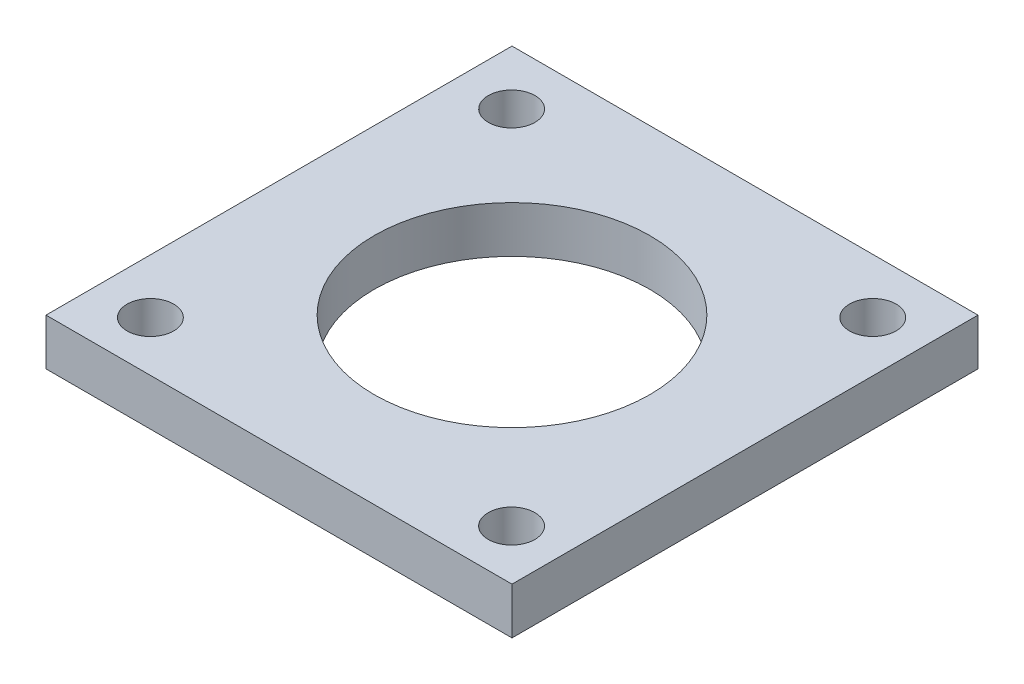
ISO-10303-21;
HEADER;
FILE_DESCRIPTION(('STEP AP214'),'2;1');
FILE_NAME('part.step','',(''),(''),'','','');
FILE_SCHEMA(('AUTOMOTIVE_DESIGN { 1 0 10303 214 1 1 1 1 }'));
ENDSEC;
DATA;
#1=APPLICATION_CONTEXT('core data for automotive mechanical design processes');
#2=APPLICATION_PROTOCOL_DEFINITION('international standard','automotive_design',2000,#1);
#3=PRODUCT_CONTEXT('',#1,'mechanical');
#4=PRODUCT('Part','Part','',(#3));
#5=PRODUCT_RELATED_PRODUCT_CATEGORY('part','',(#4));
#6=PRODUCT_DEFINITION_FORMATION('','',#4);
#7=PRODUCT_DEFINITION_CONTEXT('part definition',#1,'design');
#8=PRODUCT_DEFINITION('design','',#6,#7);
#9=PRODUCT_DEFINITION_SHAPE('','',#8);
#10=(LENGTH_UNIT() NAMED_UNIT(*) SI_UNIT(.MILLI.,.METRE.));
#11=(NAMED_UNIT(*) PLANE_ANGLE_UNIT() SI_UNIT($,.RADIAN.));
#12=(NAMED_UNIT(*) SI_UNIT($,.STERADIAN.) SOLID_ANGLE_UNIT());
#13=UNCERTAINTY_MEASURE_WITH_UNIT(LENGTH_MEASURE(1.E-05),#10,'distance_accuracy_value','');
#14=(GEOMETRIC_REPRESENTATION_CONTEXT(3) GLOBAL_UNCERTAINTY_ASSIGNED_CONTEXT((#13)) GLOBAL_UNIT_ASSIGNED_CONTEXT((#10,
#11,#12)) REPRESENTATION_CONTEXT('',''));
#15=CARTESIAN_POINT('',(0.,0.,0.));
#16=DIRECTION('',(0.,0.,1.));
#17=DIRECTION('',(1.,0.,0.));
#18=AXIS2_PLACEMENT_3D('',#15,#16,#17);
#19=CARTESIAN_POINT('',(0.,4.,0.));
#20=DIRECTION('',(0.,-1.,0.));
#21=DIRECTION('',(0.,0.,-1.));
#22=AXIS2_PLACEMENT_3D('',#19,#20,#21);
#23=PLANE('',#22);
#24=DIRECTION('',(0.,0.,-1.));
#25=VECTOR('',#24,1.);
#26=CARTESIAN_POINT('',(19.9448529432846,4.,19.0527712063753));
#27=LINE('',#26,#25);
#28=CARTESIAN_POINT('',(19.9448529432846,4.,19.0527712063753));
#29=VERTEX_POINT('',#28);
#30=CARTESIAN_POINT('',(19.9448529432846,4.,-20.9472287936247));
#31=VERTEX_POINT('',#30);
#32=EDGE_CURVE('E84',#29,#31,#27,.T.);
#33=ORIENTED_EDGE('',*,*,#32,.T.);
#34=DIRECTION('',(-1.,0.,0.));
#35=VECTOR('',#34,1.);
#36=CARTESIAN_POINT('',(-20.0551470567154,4.,-20.9472287936247));
#37=LINE('',#36,#35);
#38=CARTESIAN_POINT('',(-20.0551470567154,4.,-20.9472287936247));
#39=VERTEX_POINT('',#38);
#40=EDGE_CURVE('E79',#31,#39,#37,.T.);
#41=ORIENTED_EDGE('',*,*,#40,.T.);
#42=DIRECTION('',(0.,0.,1.));
#43=VECTOR('',#42,1.);
#44=CARTESIAN_POINT('',(-20.0551470567154,4.,19.0527712063753));
#45=LINE('',#44,#43);
#46=CARTESIAN_POINT('',(-20.0551470567154,4.,19.0527712063753));
#47=VERTEX_POINT('',#46);
#48=EDGE_CURVE('E82',#39,#47,#45,.T.);
#49=ORIENTED_EDGE('',*,*,#48,.T.);
#50=DIRECTION('',(1.,0.,0.));
#51=VECTOR('',#50,1.);
#52=CARTESIAN_POINT('',(-20.0551470567154,4.,19.0527712063753));
#53=LINE('',#52,#51);
#54=EDGE_CURVE('E49',#47,#29,#53,.T.);
#55=ORIENTED_EDGE('',*,*,#54,.T.);
#56=EDGE_LOOP('',(#33,#41,#49,#55));
#57=FACE_BOUND('',#56,.T.);
#58=CARTESIAN_POINT('',(-0.0551470567154064,4.,-0.94722879362474));
#59=DIRECTION('',(0.,1.,0.));
#60=DIRECTION('',(0.,0.,1.));
#61=AXIS2_PLACEMENT_3D('',#58,#59,#60);
#62=CIRCLE('',#61,11.82922145);
#63=CARTESIAN_POINT('',(-0.0551470567154064,4.,10.8819926563753));
#64=VERTEX_POINT('',#63);
#65=EDGE_CURVE('E99',#64,#64,#62,.T.);
#66=ORIENTED_EDGE('',*,*,#65,.F.);
#67=EDGE_LOOP('',(#66));
#68=FACE_BOUND('',#67,.T.);
#69=CARTESIAN_POINT('',(-15.393266988558,4.,-16.2545862153515));
#70=DIRECTION('',(0.,1.,0.));
#71=DIRECTION('',(0.,0.,1.));
#72=AXIS2_PLACEMENT_3D('',#69,#70,#71);
#73=CIRCLE('',#72,1.99999907567776);
#74=CARTESIAN_POINT('',(-15.393266988558,4.,-14.2545871396737));
#75=VERTEX_POINT('',#74);
#76=EDGE_CURVE('E114',#75,#75,#73,.T.);
#77=ORIENTED_EDGE('',*,*,#76,.F.);
#78=EDGE_LOOP('',(#77));
#79=FACE_BOUND('',#78,.T.);
#80=CARTESIAN_POINT('',(15.6067314462533,4.,-16.2545857636989));
#81=DIRECTION('',(0.,1.,0.));
#82=DIRECTION('',(0.,0.,1.));
#83=AXIS2_PLACEMENT_3D('',#80,#81,#82);
#84=CIRCLE('',#83,1.99999907567777);
#85=CARTESIAN_POINT('',(15.6067314462533,4.,-14.2545866880212));
#86=VERTEX_POINT('',#85);
#87=EDGE_CURVE('E120',#86,#86,#84,.T.);
#88=ORIENTED_EDGE('',*,*,#87,.F.);
#89=EDGE_LOOP('',(#88));
#90=FACE_BOUND('',#89,.T.);
#91=CARTESIAN_POINT('',(-15.3932688382915,4.,14.7527712063753));
#92=DIRECTION('',(0.,1.,0.));
#93=DIRECTION('',(0.,0.,1.));
#94=AXIS2_PLACEMENT_3D('',#91,#92,#93);
#95=CIRCLE('',#94,1.99999907567776);
#96=CARTESIAN_POINT('',(-15.3932688382915,4.,16.752770282053));
#97=VERTEX_POINT('',#96);
#98=EDGE_CURVE('E126',#97,#97,#95,.T.);
#99=ORIENTED_EDGE('',*,*,#98,.F.);
#100=EDGE_LOOP('',(#99));
#101=FACE_BOUND('',#100,.T.);
#102=CARTESIAN_POINT('',(15.6076897711877,4.,14.752898519498));
#103=DIRECTION('',(0.,1.,0.));
#104=DIRECTION('',(0.,0.,1.));
#105=AXIS2_PLACEMENT_3D('',#102,#103,#104);
#106=CIRCLE('',#105,1.99999907567776);
#107=CARTESIAN_POINT('',(15.6076897711877,4.,16.7528975951758));
#108=VERTEX_POINT('',#107);
#109=EDGE_CURVE('E132',#108,#108,#106,.T.);
#110=ORIENTED_EDGE('',*,*,#109,.F.);
#111=EDGE_LOOP('',(#110));
#112=FACE_BOUND('',#111,.T.);
#113=ADVANCED_FACE('F32',(#57,#68,#79,#90,#101,#112),#23,.F.);
#114=CARTESIAN_POINT('',(0.,0.,0.));
#115=DIRECTION('',(0.,-1.,0.));
#116=DIRECTION('',(0.,0.,-1.));
#117=AXIS2_PLACEMENT_3D('',#114,#115,#116);
#118=PLANE('',#117);
#119=CARTESIAN_POINT('',(-15.3932688382915,0.,14.7527712063753));
#120=DIRECTION('',(0.,1.,0.));
#121=DIRECTION('',(0.,0.,1.));
#122=AXIS2_PLACEMENT_3D('',#119,#120,#121);
#123=CIRCLE('',#122,1.99999907567776);
#124=CARTESIAN_POINT('',(-15.3932688382915,0.,16.752770282053));
#125=VERTEX_POINT('',#124);
#126=EDGE_CURVE('E129',#125,#125,#123,.T.);
#127=ORIENTED_EDGE('',*,*,#126,.T.);
#128=EDGE_LOOP('',(#127));
#129=FACE_BOUND('',#128,.T.);
#130=CARTESIAN_POINT('',(-15.393266988558,0.,-16.2545862153515));
#131=DIRECTION('',(0.,1.,0.));
#132=DIRECTION('',(0.,0.,1.));
#133=AXIS2_PLACEMENT_3D('',#130,#131,#132);
#134=CIRCLE('',#133,1.99999907567776);
#135=CARTESIAN_POINT('',(-15.393266988558,0.,-14.2545871396737));
#136=VERTEX_POINT('',#135);
#137=EDGE_CURVE('E117',#136,#136,#134,.T.);
#138=ORIENTED_EDGE('',*,*,#137,.T.);
#139=EDGE_LOOP('',(#138));
#140=FACE_BOUND('',#139,.T.);
#141=DIRECTION('',(0.,0.,-1.));
#142=VECTOR('',#141,1.);
#143=CARTESIAN_POINT('',(19.9448529432846,0.,19.0527712063753));
#144=LINE('',#143,#142);
#145=CARTESIAN_POINT('',(19.9448529432846,0.,19.0527712063753));
#146=VERTEX_POINT('',#145);
#147=CARTESIAN_POINT('',(19.9448529432846,0.,-20.9472287936247));
#148=VERTEX_POINT('',#147);
#149=EDGE_CURVE('E96',#146,#148,#144,.T.);
#150=ORIENTED_EDGE('',*,*,#149,.F.);
#151=DIRECTION('',(1.,0.,0.));
#152=VECTOR('',#151,1.);
#153=CARTESIAN_POINT('',(-20.0551470567154,0.,19.0527712063753));
#154=LINE('',#153,#152);
#155=CARTESIAN_POINT('',(-20.0551470567154,0.,19.0527712063753));
#156=VERTEX_POINT('',#155);
#157=EDGE_CURVE('E72',#156,#146,#154,.T.);
#158=ORIENTED_EDGE('',*,*,#157,.F.);
#159=DIRECTION('',(0.,0.,1.));
#160=VECTOR('',#159,1.);
#161=CARTESIAN_POINT('',(-20.0551470567154,0.,19.0527712063753));
#162=LINE('',#161,#160);
#163=CARTESIAN_POINT('',(-20.0551470567154,0.,-20.9472287936247));
#164=VERTEX_POINT('',#163);
#165=EDGE_CURVE('E66',#164,#156,#162,.T.);
#166=ORIENTED_EDGE('',*,*,#165,.F.);
#167=DIRECTION('',(-1.,0.,0.));
#168=VECTOR('',#167,1.);
#169=CARTESIAN_POINT('',(-20.0551470567154,0.,-20.9472287936247));
#170=LINE('',#169,#168);
#171=EDGE_CURVE('E88',#148,#164,#170,.T.);
#172=ORIENTED_EDGE('',*,*,#171,.F.);
#173=EDGE_LOOP('',(#150,#158,#166,#172));
#174=FACE_BOUND('',#173,.T.);
#175=CARTESIAN_POINT('',(-0.0551470567154064,0.,-0.94722879362474));
#176=DIRECTION('',(0.,1.,0.));
#177=DIRECTION('',(0.,0.,1.));
#178=AXIS2_PLACEMENT_3D('',#175,#176,#177);
#179=CIRCLE('',#178,11.82922145);
#180=CARTESIAN_POINT('',(-0.0551470567154064,0.,10.8819926563753));
#181=VERTEX_POINT('',#180);
#182=EDGE_CURVE('E111',#181,#181,#179,.T.);
#183=ORIENTED_EDGE('',*,*,#182,.T.);
#184=EDGE_LOOP('',(#183));
#185=FACE_BOUND('',#184,.T.);
#186=CARTESIAN_POINT('',(15.6067314462533,0.,-16.2545857636989));
#187=DIRECTION('',(0.,1.,0.));
#188=DIRECTION('',(0.,0.,1.));
#189=AXIS2_PLACEMENT_3D('',#186,#187,#188);
#190=CIRCLE('',#189,1.99999907567777);
#191=CARTESIAN_POINT('',(15.6067314462533,0.,-14.2545866880212));
#192=VERTEX_POINT('',#191);
#193=EDGE_CURVE('E123',#192,#192,#190,.T.);
#194=ORIENTED_EDGE('',*,*,#193,.T.);
#195=EDGE_LOOP('',(#194));
#196=FACE_BOUND('',#195,.T.);
#197=CARTESIAN_POINT('',(15.6076897711877,0.,14.752898519498));
#198=DIRECTION('',(0.,1.,0.));
#199=DIRECTION('',(0.,0.,1.));
#200=AXIS2_PLACEMENT_3D('',#197,#198,#199);
#201=CIRCLE('',#200,1.99999907567776);
#202=CARTESIAN_POINT('',(15.6076897711877,0.,16.7528975951758));
#203=VERTEX_POINT('',#202);
#204=EDGE_CURVE('E135',#203,#203,#201,.T.);
#205=ORIENTED_EDGE('',*,*,#204,.T.);
#206=EDGE_LOOP('',(#205));
#207=FACE_BOUND('',#206,.T.);
#208=ADVANCED_FACE('F107',(#129,#140,#174,#185,#196,#207),#118,.T.);
#209=CARTESIAN_POINT('',(19.9448529432846,4.,19.0527712063753));
#210=DIRECTION('',(-1.,0.,0.));
#211=DIRECTION('',(0.,0.,1.));
#212=AXIS2_PLACEMENT_3D('',#209,#210,#211);
#213=PLANE('',#212);
#214=ORIENTED_EDGE('',*,*,#149,.T.);
#215=DIRECTION('',(0.,-1.,0.));
#216=VECTOR('',#215,1.);
#217=CARTESIAN_POINT('',(19.9448529432846,4.,-20.9472287936247));
#218=LINE('',#217,#216);
#219=EDGE_CURVE('E11',#31,#148,#218,.T.);
#220=ORIENTED_EDGE('',*,*,#219,.F.);
#221=ORIENTED_EDGE('',*,*,#32,.F.);
#222=DIRECTION('',(0.,-1.,0.));
#223=VECTOR('',#222,1.);
#224=CARTESIAN_POINT('',(19.9448529432846,4.,19.0527712063753));
#225=LINE('',#224,#223);
#226=EDGE_CURVE('E92',#29,#146,#225,.T.);
#227=ORIENTED_EDGE('',*,*,#226,.T.);
#228=EDGE_LOOP('',(#214,#220,#221,#227));
#229=FACE_BOUND('',#228,.T.);
#230=ADVANCED_FACE('F34',(#229),#213,.F.);
#231=CARTESIAN_POINT('',(-20.0551470567154,4.,-20.9472287936247));
#232=DIRECTION('',(0.,0.,1.));
#233=DIRECTION('',(1.,0.,0.));
#234=AXIS2_PLACEMENT_3D('',#231,#232,#233);
#235=PLANE('',#234);
#236=ORIENTED_EDGE('',*,*,#171,.T.);
#237=DIRECTION('',(0.,-1.,0.));
#238=VECTOR('',#237,1.);
#239=CARTESIAN_POINT('',(-20.0551470567154,4.,-20.9472287936247));
#240=LINE('',#239,#238);
#241=EDGE_CURVE('E41',#39,#164,#240,.T.);
#242=ORIENTED_EDGE('',*,*,#241,.F.);
#243=ORIENTED_EDGE('',*,*,#40,.F.);
#244=ORIENTED_EDGE('',*,*,#219,.T.);
#245=EDGE_LOOP('',(#236,#242,#243,#244));
#246=FACE_BOUND('',#245,.T.);
#247=ADVANCED_FACE('F87',(#246),#235,.F.);
#248=CARTESIAN_POINT('',(-20.0551470567154,4.,19.0527712063753));
#249=DIRECTION('',(1.,0.,0.));
#250=DIRECTION('',(0.,0.,-1.));
#251=AXIS2_PLACEMENT_3D('',#248,#249,#250);
#252=PLANE('',#251);
#253=ORIENTED_EDGE('',*,*,#165,.T.);
#254=DIRECTION('',(0.,-1.,0.));
#255=VECTOR('',#254,1.);
#256=CARTESIAN_POINT('',(-20.0551470567154,4.,19.0527712063753));
#257=LINE('',#256,#255);
#258=EDGE_CURVE('E89',#47,#156,#257,.T.);
#259=ORIENTED_EDGE('',*,*,#258,.F.);
#260=ORIENTED_EDGE('',*,*,#48,.F.);
#261=ORIENTED_EDGE('',*,*,#241,.T.);
#262=EDGE_LOOP('',(#253,#259,#260,#261));
#263=FACE_BOUND('',#262,.T.);
#264=ADVANCED_FACE('F90',(#263),#252,.F.);
#265=CARTESIAN_POINT('',(-20.0551470567154,4.,19.0527712063753));
#266=DIRECTION('',(0.,0.,-1.));
#267=DIRECTION('',(-1.,0.,0.));
#268=AXIS2_PLACEMENT_3D('',#265,#266,#267);
#269=PLANE('',#268);
#270=ORIENTED_EDGE('',*,*,#157,.T.);
#271=ORIENTED_EDGE('',*,*,#226,.F.);
#272=ORIENTED_EDGE('',*,*,#54,.F.);
#273=ORIENTED_EDGE('',*,*,#258,.T.);
#274=EDGE_LOOP('',(#270,#271,#272,#273));
#275=FACE_BOUND('',#274,.T.);
#276=ADVANCED_FACE('F104',(#275),#269,.F.);
#277=CARTESIAN_POINT('',(-0.0551470567154064,4.,-0.94722879362474));
#278=DIRECTION('',(0.,-1.,0.));
#279=DIRECTION('',(0.,0.,-1.));
#280=AXIS2_PLACEMENT_3D('',#277,#278,#279);
#281=CYLINDRICAL_SURFACE('',#280,11.82922145);
#282=ORIENTED_EDGE('',*,*,#65,.T.);
#283=EDGE_LOOP('',(#282));
#284=FACE_BOUND('',#283,.T.);
#285=ORIENTED_EDGE('',*,*,#182,.F.);
#286=EDGE_LOOP('',(#285));
#287=FACE_BOUND('',#286,.T.);
#288=ADVANCED_FACE('F152',(#284,#287),#281,.F.);
#289=CARTESIAN_POINT('',(-15.393266988558,4.,-16.2545862153515));
#290=DIRECTION('',(0.,-1.,0.));
#291=DIRECTION('',(0.,0.,-1.));
#292=AXIS2_PLACEMENT_3D('',#289,#290,#291);
#293=CYLINDRICAL_SURFACE('',#292,1.99999907567776);
#294=ORIENTED_EDGE('',*,*,#76,.T.);
#295=EDGE_LOOP('',(#294));
#296=FACE_BOUND('',#295,.T.);
#297=ORIENTED_EDGE('',*,*,#137,.F.);
#298=EDGE_LOOP('',(#297));
#299=FACE_BOUND('',#298,.T.);
#300=ADVANCED_FACE('F198',(#296,#299),#293,.F.);
#301=CARTESIAN_POINT('',(15.6067314462533,4.,-16.2545857636989));
#302=DIRECTION('',(0.,-1.,0.));
#303=DIRECTION('',(0.,0.,-1.));
#304=AXIS2_PLACEMENT_3D('',#301,#302,#303);
#305=CYLINDRICAL_SURFACE('',#304,1.99999907567777);
#306=ORIENTED_EDGE('',*,*,#87,.T.);
#307=EDGE_LOOP('',(#306));
#308=FACE_BOUND('',#307,.T.);
#309=ORIENTED_EDGE('',*,*,#193,.F.);
#310=EDGE_LOOP('',(#309));
#311=FACE_BOUND('',#310,.T.);
#312=ADVANCED_FACE('F206',(#308,#311),#305,.F.);
#313=CARTESIAN_POINT('',(-15.3932688382915,4.,14.7527712063753));
#314=DIRECTION('',(0.,-1.,0.));
#315=DIRECTION('',(0.,0.,-1.));
#316=AXIS2_PLACEMENT_3D('',#313,#314,#315);
#317=CYLINDRICAL_SURFACE('',#316,1.99999907567776);
#318=ORIENTED_EDGE('',*,*,#98,.T.);
#319=EDGE_LOOP('',(#318));
#320=FACE_BOUND('',#319,.T.);
#321=ORIENTED_EDGE('',*,*,#126,.F.);
#322=EDGE_LOOP('',(#321));
#323=FACE_BOUND('',#322,.T.);
#324=ADVANCED_FACE('F214',(#320,#323),#317,.F.);
#325=CARTESIAN_POINT('',(15.6076897711877,4.,14.752898519498));
#326=DIRECTION('',(0.,-1.,0.));
#327=DIRECTION('',(0.,0.,-1.));
#328=AXIS2_PLACEMENT_3D('',#325,#326,#327);
#329=CYLINDRICAL_SURFACE('',#328,1.99999907567776);
#330=ORIENTED_EDGE('',*,*,#109,.T.);
#331=EDGE_LOOP('',(#330));
#332=FACE_BOUND('',#331,.T.);
#333=ORIENTED_EDGE('',*,*,#204,.F.);
#334=EDGE_LOOP('',(#333));
#335=FACE_BOUND('',#334,.T.);
#336=ADVANCED_FACE('F141',(#332,#335),#329,.F.);
#337=CLOSED_SHELL('',(#113,#208,#230,#247,#264,#276,#288,#300,#312,#324,#336));
#338=MANIFOLD_SOLID_BREP('B2',#337);
#339=ADVANCED_BREP_SHAPE_REPRESENTATION('',(#18,#338),#14);
#340=SHAPE_DEFINITION_REPRESENTATION(#9,#339);
ENDSEC;
END-ISO-10303-21;
